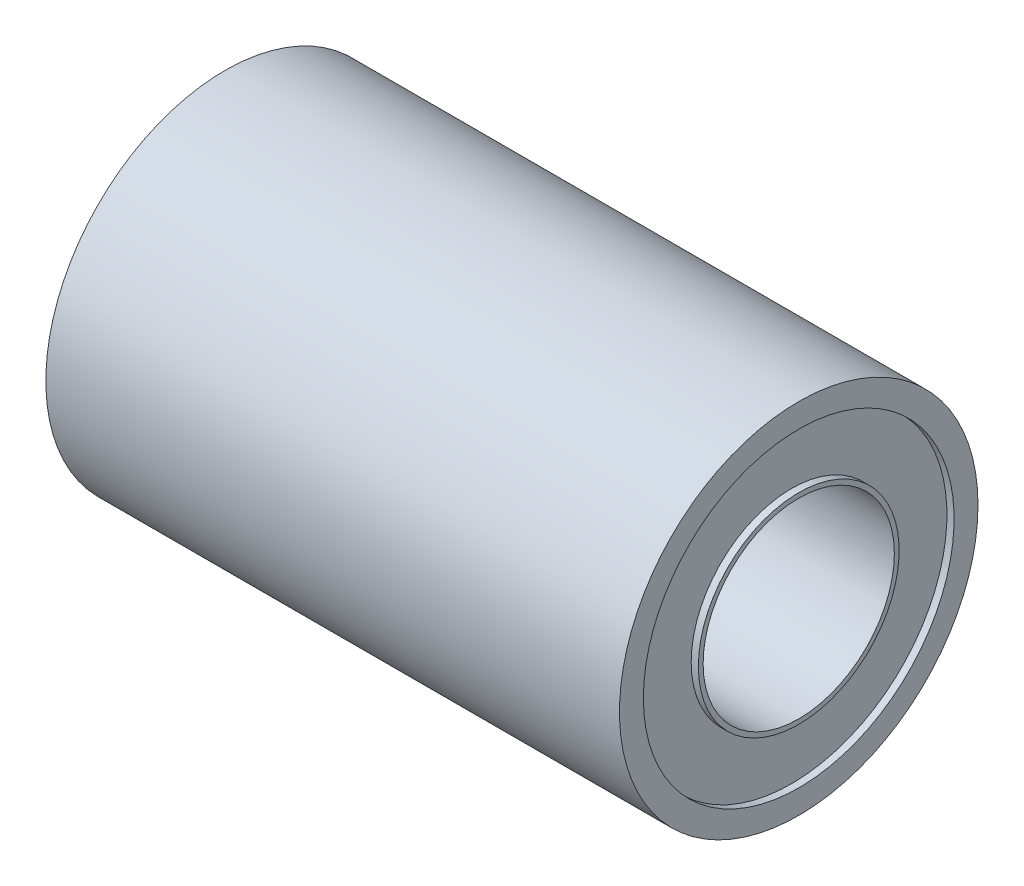
ISO-10303-21;
HEADER;
FILE_DESCRIPTION(('STEP AP214'),'2;1');
FILE_NAME('part.step','',(''),(''),'','','');
FILE_SCHEMA(('AUTOMOTIVE_DESIGN { 1 0 10303 214 1 1 1 1 }'));
ENDSEC;
DATA;
#1=APPLICATION_CONTEXT('core data for automotive mechanical design processes');
#2=APPLICATION_PROTOCOL_DEFINITION('international standard','automotive_design',2000,#1);
#3=PRODUCT_CONTEXT('',#1,'mechanical');
#4=PRODUCT('Part','Part','',(#3));
#5=PRODUCT_RELATED_PRODUCT_CATEGORY('part','',(#4));
#6=PRODUCT_DEFINITION_FORMATION('','',#4);
#7=PRODUCT_DEFINITION_CONTEXT('part definition',#1,'design');
#8=PRODUCT_DEFINITION('design','',#6,#7);
#9=PRODUCT_DEFINITION_SHAPE('','',#8);
#10=(LENGTH_UNIT() NAMED_UNIT(*) SI_UNIT(.MILLI.,.METRE.));
#11=(NAMED_UNIT(*) PLANE_ANGLE_UNIT() SI_UNIT($,.RADIAN.));
#12=(NAMED_UNIT(*) SI_UNIT($,.STERADIAN.) SOLID_ANGLE_UNIT());
#13=UNCERTAINTY_MEASURE_WITH_UNIT(LENGTH_MEASURE(1.E-05),#10,'distance_accuracy_value','');
#14=(GEOMETRIC_REPRESENTATION_CONTEXT(3) GLOBAL_UNCERTAINTY_ASSIGNED_CONTEXT((#13)) GLOBAL_UNIT_ASSIGNED_CONTEXT((#10,
#11,#12)) REPRESENTATION_CONTEXT('',''));
#15=CARTESIAN_POINT('',(0.,0.,0.));
#16=DIRECTION('',(0.,0.,1.));
#17=DIRECTION('',(1.,0.,0.));
#18=AXIS2_PLACEMENT_3D('',#15,#16,#17);
#19=CARTESIAN_POINT('',(0.,0.,0.));
#20=DIRECTION('',(1.,0.,0.));
#21=DIRECTION('',(0.,0.,-1.));
#22=AXIS2_PLACEMENT_3D('',#19,#20,#21);
#23=PLANE('',#22);
#24=CARTESIAN_POINT('',(0.,0.,0.));
#25=DIRECTION('',(1.,0.,0.));
#26=DIRECTION('',(0.,0.,-1.));
#27=AXIS2_PLACEMENT_3D('',#24,#25,#26);
#28=CIRCLE('',#27,4.);
#29=CARTESIAN_POINT('',(0.,0.,-4.));
#30=VERTEX_POINT('',#29);
#31=EDGE_CURVE('E45',#30,#30,#28,.T.);
#32=ORIENTED_EDGE('',*,*,#31,.T.);
#33=EDGE_LOOP('',(#32));
#34=FACE_BOUND('',#33,.T.);
#35=CARTESIAN_POINT('',(0.,0.,0.));
#36=DIRECTION('',(-1.,0.,0.));
#37=DIRECTION('',(0.,0.,1.));
#38=AXIS2_PLACEMENT_3D('',#35,#36,#37);
#39=CIRCLE('',#38,4.2);
#40=CARTESIAN_POINT('',(0.,0.,4.2));
#41=VERTEX_POINT('',#40);
#42=EDGE_CURVE('E62',#41,#41,#39,.T.);
#43=ORIENTED_EDGE('',*,*,#42,.T.);
#44=EDGE_LOOP('',(#43));
#45=FACE_BOUND('',#44,.T.);
#46=ADVANCED_FACE('F32',(#34,#45),#23,.F.);
#47=CARTESIAN_POINT('',(0.,0.,0.));
#48=DIRECTION('',(1.,0.,0.));
#49=DIRECTION('',(0.,0.,-1.));
#50=AXIS2_PLACEMENT_3D('',#47,#48,#49);
#51=CIRCLE('',#50,7.5);
#52=CARTESIAN_POINT('',(0.,0.,-7.5));
#53=VERTEX_POINT('',#52);
#54=EDGE_CURVE('E36',#53,#53,#51,.T.);
#55=ORIENTED_EDGE('',*,*,#54,.F.);
#56=EDGE_LOOP('',(#55));
#57=FACE_BOUND('',#56,.T.);
#58=CARTESIAN_POINT('',(0.,0.,0.));
#59=DIRECTION('',(-1.,0.,0.));
#60=DIRECTION('',(0.,0.,1.));
#61=AXIS2_PLACEMENT_3D('',#58,#59,#60);
#62=CIRCLE('',#61,6.5);
#63=CARTESIAN_POINT('',(0.,0.,6.5));
#64=VERTEX_POINT('',#63);
#65=EDGE_CURVE('E65',#64,#64,#62,.T.);
#66=ORIENTED_EDGE('',*,*,#65,.F.);
#67=EDGE_LOOP('',(#66));
#68=FACE_BOUND('',#67,.T.);
#69=ADVANCED_FACE('F89',(#57,#68),#23,.F.);
#70=CARTESIAN_POINT('',(24.,0.,0.));
#71=DIRECTION('',(1.,0.,0.));
#72=DIRECTION('',(0.,0.,-1.));
#73=AXIS2_PLACEMENT_3D('',#70,#71,#72);
#74=PLANE('',#73);
#75=CARTESIAN_POINT('',(24.,0.,0.));
#76=DIRECTION('',(1.,0.,0.));
#77=DIRECTION('',(0.,0.,-1.));
#78=AXIS2_PLACEMENT_3D('',#75,#76,#77);
#79=CIRCLE('',#78,7.5);
#80=CARTESIAN_POINT('',(24.,0.,-7.5));
#81=VERTEX_POINT('',#80);
#82=EDGE_CURVE('E10',#81,#81,#79,.T.);
#83=ORIENTED_EDGE('',*,*,#82,.T.);
#84=EDGE_LOOP('',(#83));
#85=FACE_BOUND('',#84,.T.);
#86=CARTESIAN_POINT('',(24.,0.,0.));
#87=DIRECTION('',(-1.,0.,0.));
#88=DIRECTION('',(0.,0.,1.));
#89=AXIS2_PLACEMENT_3D('',#86,#87,#88);
#90=CIRCLE('',#89,6.5);
#91=CARTESIAN_POINT('',(24.,0.,6.5));
#92=VERTEX_POINT('',#91);
#93=EDGE_CURVE('E48',#92,#92,#90,.T.);
#94=ORIENTED_EDGE('',*,*,#93,.T.);
#95=EDGE_LOOP('',(#94));
#96=FACE_BOUND('',#95,.T.);
#97=ADVANCED_FACE('F94',(#85,#96),#74,.T.);
#98=CARTESIAN_POINT('',(24.,0.,0.));
#99=DIRECTION('',(1.,0.,0.));
#100=DIRECTION('',(0.,0.,-1.));
#101=AXIS2_PLACEMENT_3D('',#98,#99,#100);
#102=CIRCLE('',#101,4.);
#103=CARTESIAN_POINT('',(24.,0.,-4.));
#104=VERTEX_POINT('',#103);
#105=EDGE_CURVE('E43',#104,#104,#102,.T.);
#106=ORIENTED_EDGE('',*,*,#105,.F.);
#107=EDGE_LOOP('',(#106));
#108=FACE_BOUND('',#107,.T.);
#109=CARTESIAN_POINT('',(24.,0.,0.));
#110=DIRECTION('',(-1.,0.,0.));
#111=DIRECTION('',(0.,0.,1.));
#112=AXIS2_PLACEMENT_3D('',#109,#110,#111);
#113=CIRCLE('',#112,4.2);
#114=CARTESIAN_POINT('',(24.,0.,4.2));
#115=VERTEX_POINT('',#114);
#116=EDGE_CURVE('E59',#115,#115,#113,.T.);
#117=ORIENTED_EDGE('',*,*,#116,.F.);
#118=EDGE_LOOP('',(#117));
#119=FACE_BOUND('',#118,.T.);
#120=ADVANCED_FACE('F100',(#108,#119),#74,.T.);
#121=CARTESIAN_POINT('',(24.,0.,0.));
#122=DIRECTION('',(-1.,0.,0.));
#123=DIRECTION('',(0.,0.,1.));
#124=AXIS2_PLACEMENT_3D('',#121,#122,#123);
#125=CYLINDRICAL_SURFACE('',#124,7.5);
#126=ORIENTED_EDGE('',*,*,#82,.F.);
#127=EDGE_LOOP('',(#126));
#128=FACE_BOUND('',#127,.T.);
#129=ORIENTED_EDGE('',*,*,#54,.T.);
#130=EDGE_LOOP('',(#129));
#131=FACE_BOUND('',#130,.T.);
#132=ADVANCED_FACE('F34',(#128,#131),#125,.T.);
#133=CARTESIAN_POINT('',(24.,0.,0.));
#134=DIRECTION('',(-1.,0.,0.));
#135=DIRECTION('',(0.,0.,1.));
#136=AXIS2_PLACEMENT_3D('',#133,#134,#135);
#137=CYLINDRICAL_SURFACE('',#136,4.);
#138=ORIENTED_EDGE('',*,*,#105,.T.);
#139=EDGE_LOOP('',(#138));
#140=FACE_BOUND('',#139,.T.);
#141=ORIENTED_EDGE('',*,*,#31,.F.);
#142=EDGE_LOOP('',(#141));
#143=FACE_BOUND('',#142,.T.);
#144=ADVANCED_FACE('F101',(#140,#143),#137,.F.);
#145=CARTESIAN_POINT('',(0.,0.,0.));
#146=DIRECTION('',(-1.,0.,0.));
#147=DIRECTION('',(0.,0.,1.));
#148=AXIS2_PLACEMENT_3D('',#145,#146,#147);
#149=CYLINDRICAL_SURFACE('',#148,6.5);
#150=CARTESIAN_POINT('',(23.7,0.,0.));
#151=DIRECTION('',(-1.,0.,0.));
#152=DIRECTION('',(0.,0.,1.));
#153=AXIS2_PLACEMENT_3D('',#150,#151,#152);
#154=CIRCLE('',#153,6.5);
#155=CARTESIAN_POINT('',(23.7,0.,6.5));
#156=VERTEX_POINT('',#155);
#157=EDGE_CURVE('E53',#156,#156,#154,.T.);
#158=ORIENTED_EDGE('',*,*,#157,.T.);
#159=EDGE_LOOP('',(#158));
#160=FACE_BOUND('',#159,.T.);
#161=ORIENTED_EDGE('',*,*,#93,.F.);
#162=EDGE_LOOP('',(#161));
#163=FACE_BOUND('',#162,.T.);
#164=ADVANCED_FACE('F104',(#160,#163),#149,.F.);
#165=CARTESIAN_POINT('',(23.7,6.5,0.));
#166=DIRECTION('',(1.,0.,0.));
#167=DIRECTION('',(0.,0.,-1.));
#168=AXIS2_PLACEMENT_3D('',#165,#166,#167);
#169=PLANE('',#168);
#170=CARTESIAN_POINT('',(23.7,0.,0.));
#171=DIRECTION('',(-1.,0.,0.));
#172=DIRECTION('',(0.,0.,1.));
#173=AXIS2_PLACEMENT_3D('',#170,#171,#172);
#174=CIRCLE('',#173,4.2);
#175=CARTESIAN_POINT('',(23.7,0.,4.2));
#176=VERTEX_POINT('',#175);
#177=EDGE_CURVE('E56',#176,#176,#174,.T.);
#178=ORIENTED_EDGE('',*,*,#177,.T.);
#179=EDGE_LOOP('',(#178));
#180=FACE_BOUND('',#179,.T.);
#181=ORIENTED_EDGE('',*,*,#157,.F.);
#182=EDGE_LOOP('',(#181));
#183=FACE_BOUND('',#182,.T.);
#184=ADVANCED_FACE('F108',(#180,#183),#169,.T.);
#185=CARTESIAN_POINT('',(0.,0.,0.));
#186=DIRECTION('',(-1.,0.,0.));
#187=DIRECTION('',(0.,0.,1.));
#188=AXIS2_PLACEMENT_3D('',#185,#186,#187);
#189=CYLINDRICAL_SURFACE('',#188,4.2);
#190=ORIENTED_EDGE('',*,*,#116,.T.);
#191=EDGE_LOOP('',(#190));
#192=FACE_BOUND('',#191,.T.);
#193=ORIENTED_EDGE('',*,*,#177,.F.);
#194=EDGE_LOOP('',(#193));
#195=FACE_BOUND('',#194,.T.);
#196=ADVANCED_FACE('F112',(#192,#195),#189,.T.);
#197=CARTESIAN_POINT('',(0.,0.,0.));
#198=DIRECTION('',(-1.,0.,0.));
#199=DIRECTION('',(0.,0.,1.));
#200=AXIS2_PLACEMENT_3D('',#197,#198,#199);
#201=CYLINDRICAL_SURFACE('',#200,4.2);
#202=CARTESIAN_POINT('',(0.300000000000002,0.,0.));
#203=DIRECTION('',(-1.,0.,0.));
#204=DIRECTION('',(0.,0.,1.));
#205=AXIS2_PLACEMENT_3D('',#202,#203,#204);
#206=CIRCLE('',#205,4.2);
#207=CARTESIAN_POINT('',(0.300000000000002,0.,4.2));
#208=VERTEX_POINT('',#207);
#209=EDGE_CURVE('E71',#208,#208,#206,.T.);
#210=ORIENTED_EDGE('',*,*,#209,.T.);
#211=EDGE_LOOP('',(#210));
#212=FACE_BOUND('',#211,.T.);
#213=ORIENTED_EDGE('',*,*,#42,.F.);
#214=EDGE_LOOP('',(#213));
#215=FACE_BOUND('',#214,.T.);
#216=ADVANCED_FACE('F75',(#212,#215),#201,.T.);
#217=CARTESIAN_POINT('',(0.,0.,0.));
#218=DIRECTION('',(-1.,0.,0.));
#219=DIRECTION('',(0.,0.,1.));
#220=AXIS2_PLACEMENT_3D('',#217,#218,#219);
#221=CYLINDRICAL_SURFACE('',#220,6.5);
#222=ORIENTED_EDGE('',*,*,#65,.T.);
#223=EDGE_LOOP('',(#222));
#224=FACE_BOUND('',#223,.T.);
#225=CARTESIAN_POINT('',(0.300000000000002,0.,0.));
#226=DIRECTION('',(-1.,0.,0.));
#227=DIRECTION('',(0.,0.,1.));
#228=AXIS2_PLACEMENT_3D('',#225,#226,#227);
#229=CIRCLE('',#228,6.5);
#230=CARTESIAN_POINT('',(0.300000000000002,0.,6.5));
#231=VERTEX_POINT('',#230);
#232=EDGE_CURVE('E68',#231,#231,#229,.T.);
#233=ORIENTED_EDGE('',*,*,#232,.F.);
#234=EDGE_LOOP('',(#233));
#235=FACE_BOUND('',#234,.T.);
#236=ADVANCED_FACE('F80',(#224,#235),#221,.F.);
#237=CARTESIAN_POINT('',(0.300000000000002,6.5,0.));
#238=DIRECTION('',(-1.,0.,0.));
#239=DIRECTION('',(0.,0.,1.));
#240=AXIS2_PLACEMENT_3D('',#237,#238,#239);
#241=PLANE('',#240);
#242=ORIENTED_EDGE('',*,*,#232,.T.);
#243=EDGE_LOOP('',(#242));
#244=FACE_BOUND('',#243,.T.);
#245=ORIENTED_EDGE('',*,*,#209,.F.);
#246=EDGE_LOOP('',(#245));
#247=FACE_BOUND('',#246,.T.);
#248=ADVANCED_FACE('F78',(#244,#247),#241,.T.);
#249=CLOSED_SHELL('',(#46,#69,#97,#120,#132,#144,#164,#184,#196,#216,#236,#248));
#250=MANIFOLD_SOLID_BREP('B2',#249);
#251=ADVANCED_BREP_SHAPE_REPRESENTATION('',(#18,#250),#14);
#252=SHAPE_DEFINITION_REPRESENTATION(#9,#251);
ENDSEC;
END-ISO-10303-21;
